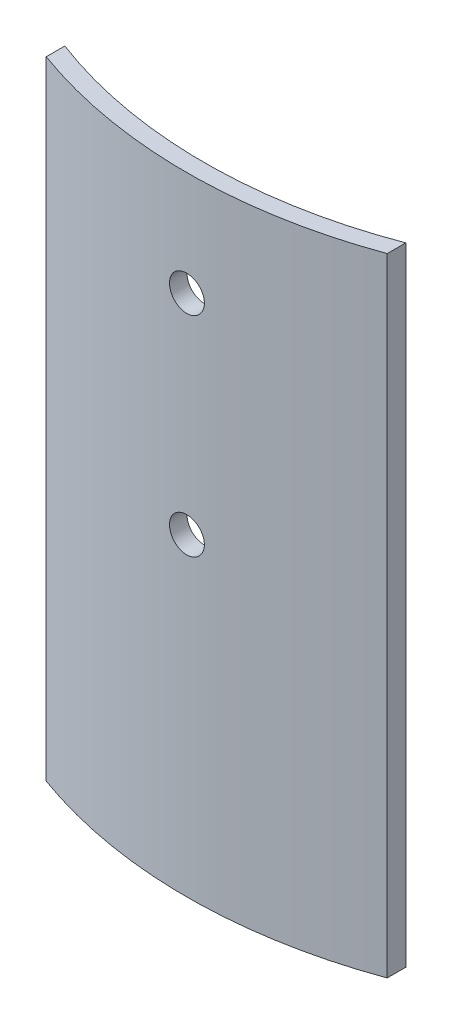
ISO-10303-21;
HEADER;
FILE_DESCRIPTION(('STEP AP214'),'2;1');
FILE_NAME('part.step','',(''),(''),'','','');
FILE_SCHEMA(('AUTOMOTIVE_DESIGN { 1 0 10303 214 1 1 1 1 }'));
ENDSEC;
DATA;
#1=APPLICATION_CONTEXT('core data for automotive mechanical design processes');
#2=APPLICATION_PROTOCOL_DEFINITION('international standard','automotive_design',2000,#1);
#3=PRODUCT_CONTEXT('',#1,'mechanical');
#4=PRODUCT('Part','Part','',(#3));
#5=PRODUCT_RELATED_PRODUCT_CATEGORY('part','',(#4));
#6=PRODUCT_DEFINITION_FORMATION('','',#4);
#7=PRODUCT_DEFINITION_CONTEXT('part definition',#1,'design');
#8=PRODUCT_DEFINITION('design','',#6,#7);
#9=PRODUCT_DEFINITION_SHAPE('','',#8);
#10=(LENGTH_UNIT() NAMED_UNIT(*) SI_UNIT(.MILLI.,.METRE.));
#11=(NAMED_UNIT(*) PLANE_ANGLE_UNIT() SI_UNIT($,.RADIAN.));
#12=(NAMED_UNIT(*) SI_UNIT($,.STERADIAN.) SOLID_ANGLE_UNIT());
#13=UNCERTAINTY_MEASURE_WITH_UNIT(LENGTH_MEASURE(1.E-05),#10,'distance_accuracy_value','');
#14=(GEOMETRIC_REPRESENTATION_CONTEXT(3) GLOBAL_UNCERTAINTY_ASSIGNED_CONTEXT((#13)) GLOBAL_UNIT_ASSIGNED_CONTEXT((#10,
#11,#12)) REPRESENTATION_CONTEXT('',''));
#15=CARTESIAN_POINT('',(0.,0.,0.));
#16=DIRECTION('',(0.,0.,1.));
#17=DIRECTION('',(1.,0.,0.));
#18=AXIS2_PLACEMENT_3D('',#15,#16,#17);
#19=CARTESIAN_POINT('',(-24.4566001041803,90.,0.));
#20=DIRECTION('',(1.,0.,0.));
#21=DIRECTION('',(0.,0.,-1.));
#22=AXIS2_PLACEMENT_3D('',#19,#20,#21);
#23=PLANE('',#22);
#24=DIRECTION('',(0.,0.,1.));
#25=VECTOR('',#24,1.);
#26=CARTESIAN_POINT('',(-24.4566001041803,0.,0.));
#27=LINE('',#26,#25);
#28=CARTESIAN_POINT('',(-24.4566001041803,0.,64.5203433914003));
#29=VERTEX_POINT('',#28);
#30=CARTESIAN_POINT('',(-24.4566001041803,0.,67.1872362234391));
#31=VERTEX_POINT('',#30);
#32=EDGE_CURVE('E111',#29,#31,#27,.T.);
#33=ORIENTED_EDGE('',*,*,#32,.T.);
#34=DIRECTION('',(0.,-1.,0.));
#35=VECTOR('',#34,1.);
#36=CARTESIAN_POINT('',(-24.4566001041803,90.,67.1872362234391));
#37=LINE('',#36,#35);
#38=CARTESIAN_POINT('',(-24.4566001041803,90.,67.1872362234391));
#39=VERTEX_POINT('',#38);
#40=EDGE_CURVE('E11',#39,#31,#37,.T.);
#41=ORIENTED_EDGE('',*,*,#40,.F.);
#42=DIRECTION('',(0.,0.,1.));
#43=VECTOR('',#42,1.);
#44=CARTESIAN_POINT('',(-24.4566001041803,90.,0.));
#45=LINE('',#44,#43);
#46=CARTESIAN_POINT('',(-24.4566001041803,90.,64.5203433914003));
#47=VERTEX_POINT('',#46);
#48=EDGE_CURVE('E96',#47,#39,#45,.T.);
#49=ORIENTED_EDGE('',*,*,#48,.F.);
#50=DIRECTION('',(0.,-1.,0.));
#51=VECTOR('',#50,1.);
#52=CARTESIAN_POINT('',(-24.4566001041803,90.,64.5203433914003));
#53=LINE('',#52,#51);
#54=EDGE_CURVE('E63',#47,#29,#53,.T.);
#55=ORIENTED_EDGE('',*,*,#54,.T.);
#56=EDGE_LOOP('',(#33,#41,#49,#55));
#57=FACE_BOUND('',#56,.T.);
#58=ADVANCED_FACE('F40',(#57),#23,.F.);
#59=CARTESIAN_POINT('',(0.,90.,0.));
#60=DIRECTION('',(0.,-1.,0.));
#61=DIRECTION('',(0.,0.,-1.));
#62=AXIS2_PLACEMENT_3D('',#59,#60,#61);
#63=CYLINDRICAL_SURFACE('',#62,71.5);
#64=CARTESIAN_POINT('',(2.5,75.,71.4562803397994));
#65=CARTESIAN_POINT('',(2.49999378886062,74.8596199603397,71.4562809291882));
#66=CARTESIAN_POINT('',(2.48813637334938,74.7191392243361,71.4566984612171));
#67=CARTESIAN_POINT('',(2.44100110362231,74.4420498246256,71.4583238557862));
#68=CARTESIAN_POINT('',(2.40569535024231,74.3054459758258,71.4595326597683));
#69=CARTESIAN_POINT('',(2.31267254222734,74.0401645764343,71.4626034999009));
#70=CARTESIAN_POINT('',(2.25496654430358,73.9114831516016,71.4644652137328));
#71=CARTESIAN_POINT('',(2.11879739659357,73.6656695587712,71.4686316847911));
#72=CARTESIAN_POINT('',(2.04033928007349,73.5485345997109,71.4709363345498));
#73=CARTESIAN_POINT('',(1.86484168475676,73.3290365963715,71.4757305087568));
#74=CARTESIAN_POINT('',(1.76779318294987,73.226680767758,71.4782201226185));
#75=CARTESIAN_POINT('',(1.55788623746994,73.039707523366,71.4831028161751));
#76=CARTESIAN_POINT('',(1.44502716135308,72.9550908175141,71.4854958920035));
#77=CARTESIAN_POINT('',(1.20667201587696,72.8059834371474,71.4899162999675));
#78=CARTESIAN_POINT('',(1.08117295016827,72.741497549629,71.4919435450623));
#79=CARTESIAN_POINT('',(0.821121544701844,72.6345133008608,71.495403012802));
#80=CARTESIAN_POINT('',(0.686569247728687,72.5920148357091,71.4968352382589));
#81=CARTESIAN_POINT('',(0.412289571420974,72.5302285796561,71.4989427039839));
#82=CARTESIAN_POINT('',(0.272564348860591,72.5109312252755,71.4996182561445));
#83=CARTESIAN_POINT('',(-0.00814381158609388,72.4960654921831,71.5001372743444));
#84=CARTESIAN_POINT('',(-0.149126743467153,72.5004970002324,71.4999807443547));
#85=CARTESIAN_POINT('',(-0.428283563094081,72.5329551703847,71.4988535073153));
#86=CARTESIAN_POINT('',(-0.566458651616255,72.5609715192641,71.4978831561356));
#87=CARTESIAN_POINT('',(-0.836143222162108,72.6397881258803,71.4952380350116));
#88=CARTESIAN_POINT('',(-0.967652686835606,72.6905884429189,71.4935632632337));
#89=CARTESIAN_POINT('',(-1.22030614234006,72.8135427686462,71.4896974219631));
#90=CARTESIAN_POINT('',(-1.34144783394711,72.8857014981762,71.4875062383498));
#91=CARTESIAN_POINT('',(-1.56990178125832,73.0493208366891,71.4828544782273));
#92=CARTESIAN_POINT('',(-1.67721399202991,73.1407815083822,71.4803939008428));
#93=CARTESIAN_POINT('',(-1.87502290090171,73.3404668575786,71.4754790568111));
#94=CARTESIAN_POINT('',(-1.96551056684102,73.4487004827125,71.4730247942469));
#95=CARTESIAN_POINT('',(-2.12703222654569,73.678827849142,71.4684005991786));
#96=CARTESIAN_POINT('',(-2.19806621679346,73.8007215929075,71.4662306667257));
#97=CARTESIAN_POINT('',(-2.31866318548506,74.0547142307168,71.4624199093821));
#98=CARTESIAN_POINT('',(-2.36822586163521,74.1868132684096,71.4607790919407));
#99=CARTESIAN_POINT('',(-2.44446743933415,74.4574643445193,71.458211889731));
#100=CARTESIAN_POINT('',(-2.47114642533175,74.5960163591205,71.4572855023263));
#101=CARTESIAN_POINT('',(-2.50085220282281,74.8755617950786,71.4562520986877));
#102=CARTESIAN_POINT('',(-2.50389151225942,75.016553884691,71.4561446488015));
#103=CARTESIAN_POINT('',(-2.4862642921378,75.2970462553616,71.4567601046832));
#104=CARTESIAN_POINT('',(-2.46559780029724,75.4365465387931,71.4574830091299));
#105=CARTESIAN_POINT('',(-2.40115599510036,75.7100604104811,71.4596772883669));
#106=CARTESIAN_POINT('',(-2.35738637875247,75.8440753425976,71.4611484786339));
#107=CARTESIAN_POINT('',(-2.24798655903736,76.1028556022163,71.4646733315948));
#108=CARTESIAN_POINT('',(-2.18235629497473,76.2276209040361,71.4667269959059));
#109=CARTESIAN_POINT('',(-2.03106594871204,76.4644179143893,71.4711863545384));
#110=CARTESIAN_POINT('',(-1.9453974398828,76.5764442362976,71.4735921968006));
#111=CARTESIAN_POINT('',(-1.75647478018708,76.7845291444771,71.478484185749));
#112=CARTESIAN_POINT('',(-1.65322057085681,76.8805876776612,71.4809703327021));
#113=CARTESIAN_POINT('',(-1.43200387649542,77.0540520914972,71.4857439405565));
#114=CARTESIAN_POINT('',(-1.31403505776439,77.1314498975649,71.4880313151752));
#115=CARTESIAN_POINT('',(-1.0667700902014,77.2653406190984,71.4921483142205));
#116=CARTESIAN_POINT('',(-0.937473971713528,77.3218335905629,71.4939779398734));
#117=CARTESIAN_POINT('',(-0.671255009445087,77.4122968540137,71.496972791538));
#118=CARTESIAN_POINT('',(-0.534333940446578,77.4462723636044,71.4981381714557));
#119=CARTESIAN_POINT('',(-0.256726696015539,77.4907533674852,71.4996737805818));
#120=CARTESIAN_POINT('',(-0.116040527495593,77.5012589048624,71.50004401125));
#121=CARTESIAN_POINT('',(0.165022809490814,77.4985011635399,71.4999475997321));
#122=CARTESIAN_POINT('',(0.305400102949971,77.4852505899914,71.4994814048797));
#123=CARTESIAN_POINT('',(0.581936231605576,77.4353829291175,71.4977655414523));
#124=CARTESIAN_POINT('',(0.718095058515618,77.3987657958958,71.4965158713385));
#125=CARTESIAN_POINT('',(0.982333259282704,77.3032065068768,71.4933737836176));
#126=CARTESIAN_POINT('',(1.11041250849163,77.2442640067519,71.4914813560973));
#127=CARTESIAN_POINT('',(1.35485554697132,77.1057306386187,71.4872669019007));
#128=CARTESIAN_POINT('',(1.47121974676568,77.0261404945034,71.4849448902862));
#129=CARTESIAN_POINT('',(1.68899000419353,76.8485303733804,71.4801315247319));
#130=CARTESIAN_POINT('',(1.79038963975965,76.7505025246098,71.4776400987537));
#131=CARTESIAN_POINT('',(1.9753212141982,76.5387864204383,71.472768861064));
#132=CARTESIAN_POINT('',(2.05884872835068,76.4250942983556,71.4703890771059));
#133=CARTESIAN_POINT('',(2.2056842037936,76.1852234779136,71.466008523013));
#134=CARTESIAN_POINT('',(2.26897775727134,76.0590359654438,71.4640080233623));
#135=CARTESIAN_POINT('',(2.3734065260776,75.7979153653011,71.4606164059693));
#136=CARTESIAN_POINT('',(2.41456811426175,75.6629929022226,71.4592245633112));
#137=CARTESIAN_POINT('',(2.46267872926961,75.4393507775201,71.4575785563825));
#138=CARTESIAN_POINT('',(2.47665654387209,75.3520821464789,71.4570938466384));
#139=CARTESIAN_POINT('',(2.4953191307325,75.1765556228304,71.4564445530515));
#140=CARTESIAN_POINT('',(2.50000390674852,75.0882977306232,71.4562799690793));
#141=CARTESIAN_POINT('',(2.5,75.,71.4562803397994));
#142=B_SPLINE_CURVE_WITH_KNOTS('',3,(#64,#65,#66,#67,#68,#69,#70,#71,#72,#73,#74,#75,#76,#77,
#78,#79,#80,#81,#82,#83,#84,#85,#86,#87,#88,#89,#90,#91,#92,#93,#94,#95,#96,#97,#98,#99,#100,
#101,#102,#103,#104,#105,#106,#107,#108,#109,#110,#111,#112,#113,#114,#115,#116,#117,#118,#119,
#120,#121,#122,#123,#124,#125,#126,#127,#128,#129,#130,#131,#132,#133,#134,#135,#136,#137,#138,
#139,#140,#141),.UNSPECIFIED.,.T.,.F.,(4,2,2,2,2,2,2,2,2,2,2,2,2,2,2,2,2,2,2,2,2,2,2,2,2,2,2,2,
2,2,2,2,2,2,2,2,2,2,4),(0.,0.420817816246982,0.842137226625239,1.26324893857242,
1.68425860663462,2.10547313564977,2.52670451861502,2.94803599188645,3.36936547413172,
3.79052122509494,4.21167496622136,4.63264464005147,5.05361540958169,5.47467929568186,
5.89574454980207,6.31703520182081,6.73832593001647,7.15962258935259,7.58091769395036,
8.00198969450399,8.42306102510209,8.84402857203189,9.26499728777504,9.68614335164778,
10.107290815651,10.5286201863924,10.9499484284921,11.3711790089036,11.7924088160044,
12.2134134098084,12.6344188305466,13.0554307447806,13.4764279006026,13.8976052059233,
14.3188866645651,14.7404674365335,15.1615447254803,15.4262352989882,15.6909257654556),.UNSPECIFIED.);
#143=CARTESIAN_POINT('',(2.5,75.,71.4562803397994));
#144=VERTEX_POINT('',#143);
#145=EDGE_CURVE('E113',#144,#144,#142,.T.);
#146=ORIENTED_EDGE('',*,*,#145,.T.);
#147=EDGE_LOOP('',(#146));
#148=FACE_BOUND('',#147,.T.);
#149=CARTESIAN_POINT('',(2.5,45.,71.4562803397994));
#150=CARTESIAN_POINT('',(2.49999378886062,44.8596199603396,71.4562809291882));
#151=CARTESIAN_POINT('',(2.48813637334938,44.7191392243361,71.4566984612171));
#152=CARTESIAN_POINT('',(2.44100110362231,44.4420498246256,71.4583238557862));
#153=CARTESIAN_POINT('',(2.40569535024231,44.3054459758258,71.4595326597683));
#154=CARTESIAN_POINT('',(2.31267254222734,44.0401645764343,71.4626034999009));
#155=CARTESIAN_POINT('',(2.25496654430359,43.9114831516016,71.4644652137328));
#156=CARTESIAN_POINT('',(2.11879739659358,43.6656695587712,71.4686316847911));
#157=CARTESIAN_POINT('',(2.04033928007349,43.5485345997109,71.4709363345498));
#158=CARTESIAN_POINT('',(1.86484168475676,43.3290365963715,71.4757305087568));
#159=CARTESIAN_POINT('',(1.76779318294987,43.226680767758,71.4782201226185));
#160=CARTESIAN_POINT('',(1.55788623746994,43.039707523366,71.4831028161751));
#161=CARTESIAN_POINT('',(1.44502716135308,42.9550908175141,71.4854958920035));
#162=CARTESIAN_POINT('',(1.20667201587696,42.8059834371474,71.4899162999675));
#163=CARTESIAN_POINT('',(1.08117295016826,42.741497549629,71.4919435450623));
#164=CARTESIAN_POINT('',(0.821121544701841,42.6345133008608,71.495403012802));
#165=CARTESIAN_POINT('',(0.686569247728684,42.5920148357091,71.4968352382589));
#166=CARTESIAN_POINT('',(0.412289571420973,42.5302285796561,71.4989427039839));
#167=CARTESIAN_POINT('',(0.27256434886059,42.5109312252755,71.4996182561445));
#168=CARTESIAN_POINT('',(-0.0081438115860948,42.4960654921831,71.5001372743444));
#169=CARTESIAN_POINT('',(-0.149126743467154,42.5004970002324,71.4999807443547));
#170=CARTESIAN_POINT('',(-0.42828356309408,42.5329551703847,71.4988535073153));
#171=CARTESIAN_POINT('',(-0.566458651616253,42.5609715192641,71.4978831561356));
#172=CARTESIAN_POINT('',(-0.836143222162106,42.6397881258803,71.4952380350116));
#173=CARTESIAN_POINT('',(-0.967652686835607,42.6905884429189,71.4935632632337));
#174=CARTESIAN_POINT('',(-1.22030614234006,42.8135427686462,71.4896974219631));
#175=CARTESIAN_POINT('',(-1.34144783394711,42.8857014981762,71.4875062383498));
#176=CARTESIAN_POINT('',(-1.56990178125832,43.0493208366891,71.4828544782273));
#177=CARTESIAN_POINT('',(-1.67721399202991,43.1407815083822,71.4803939008429));
#178=CARTESIAN_POINT('',(-1.87502290090171,43.3404668575786,71.4754790568111));
#179=CARTESIAN_POINT('',(-1.96551056684102,43.4487004827125,71.4730247942469));
#180=CARTESIAN_POINT('',(-2.12703222654569,43.678827849142,71.4684005991786));
#181=CARTESIAN_POINT('',(-2.19806621679347,43.8007215929075,71.4662306667257));
#182=CARTESIAN_POINT('',(-2.31866318548506,44.0547142307168,71.4624199093821));
#183=CARTESIAN_POINT('',(-2.36822586163521,44.1868132684096,71.4607790919407));
#184=CARTESIAN_POINT('',(-2.44446743933415,44.4574643445193,71.458211889731));
#185=CARTESIAN_POINT('',(-2.47114642533175,44.5960163591205,71.4572855023263));
#186=CARTESIAN_POINT('',(-2.50085220282281,44.8755617950786,71.4562520986877));
#187=CARTESIAN_POINT('',(-2.50389151225942,45.016553884691,71.4561446488015));
#188=CARTESIAN_POINT('',(-2.48626429213779,45.2970462553616,71.4567601046832));
#189=CARTESIAN_POINT('',(-2.46559780029724,45.4365465387931,71.4574830091299));
#190=CARTESIAN_POINT('',(-2.40115599510036,45.7100604104811,71.4596772883669));
#191=CARTESIAN_POINT('',(-2.35738637875246,45.8440753425976,71.4611484786339));
#192=CARTESIAN_POINT('',(-2.24798655903736,46.1028556022163,71.4646733315948));
#193=CARTESIAN_POINT('',(-2.18235629497473,46.2276209040361,71.4667269959059));
#194=CARTESIAN_POINT('',(-2.03106594871204,46.4644179143893,71.4711863545384));
#195=CARTESIAN_POINT('',(-1.9453974398828,46.5764442362976,71.4735921968006));
#196=CARTESIAN_POINT('',(-1.75647478018708,46.7845291444771,71.478484185749));
#197=CARTESIAN_POINT('',(-1.65322057085681,46.8805876776612,71.4809703327021));
#198=CARTESIAN_POINT('',(-1.43200387649542,47.0540520914972,71.4857439405565));
#199=CARTESIAN_POINT('',(-1.31403505776439,47.1314498975649,71.4880313151752));
#200=CARTESIAN_POINT('',(-1.0667700902014,47.2653406190984,71.4921483142205));
#201=CARTESIAN_POINT('',(-0.93747397171353,47.3218335905629,71.4939779398734));
#202=CARTESIAN_POINT('',(-0.671255009445091,47.4122968540137,71.496972791538));
#203=CARTESIAN_POINT('',(-0.534333940446581,47.4462723636044,71.4981381714557));
#204=CARTESIAN_POINT('',(-0.256726696015539,47.4907533674852,71.4996737805818));
#205=CARTESIAN_POINT('',(-0.116040527495591,47.5012589048624,71.50004401125));
#206=CARTESIAN_POINT('',(0.165022809490816,47.4985011635399,71.4999475997321));
#207=CARTESIAN_POINT('',(0.30540010294997,47.4852505899914,71.4994814048797));
#208=CARTESIAN_POINT('',(0.581936231605575,47.4353829291175,71.4977655414523));
#209=CARTESIAN_POINT('',(0.718095058515618,47.3987657958958,71.4965158713385));
#210=CARTESIAN_POINT('',(0.982333259282705,47.3032065068768,71.4933737836176));
#211=CARTESIAN_POINT('',(1.11041250849163,47.2442640067519,71.4914813560973));
#212=CARTESIAN_POINT('',(1.35485554697132,47.1057306386187,71.4872669019007));
#213=CARTESIAN_POINT('',(1.47121974676567,47.0261404945034,71.4849448902862));
#214=CARTESIAN_POINT('',(1.68899000419352,46.8485303733804,71.4801315247319));
#215=CARTESIAN_POINT('',(1.79038963975965,46.7505025246099,71.4776400987537));
#216=CARTESIAN_POINT('',(1.97532121419819,46.5387864204383,71.472768861064));
#217=CARTESIAN_POINT('',(2.05884872835068,46.4250942983556,71.4703890771059));
#218=CARTESIAN_POINT('',(2.20568420379359,46.1852234779136,71.466008523013));
#219=CARTESIAN_POINT('',(2.26897775727134,46.0590359654438,71.4640080233623));
#220=CARTESIAN_POINT('',(2.3734065260776,45.7979153653011,71.4606164059693));
#221=CARTESIAN_POINT('',(2.41456811426175,45.6629929022226,71.4592245633112));
#222=CARTESIAN_POINT('',(2.46267872926961,45.4393507775201,71.4575785563825));
#223=CARTESIAN_POINT('',(2.47665654387209,45.3520821464789,71.4570938466384));
#224=CARTESIAN_POINT('',(2.4953191307325,45.1765556228304,71.4564445530515));
#225=CARTESIAN_POINT('',(2.50000390674852,45.0882977306232,71.4562799690793));
#226=CARTESIAN_POINT('',(2.5,45.,71.4562803397994));
#227=B_SPLINE_CURVE_WITH_KNOTS('',3,(#149,#150,#151,#152,#153,#154,#155,#156,#157,#158,#159,
#160,#161,#162,#163,#164,#165,#166,#167,#168,#169,#170,#171,#172,#173,#174,#175,#176,#177,#178,
#179,#180,#181,#182,#183,#184,#185,#186,#187,#188,#189,#190,#191,#192,#193,#194,#195,#196,#197,
#198,#199,#200,#201,#202,#203,#204,#205,#206,#207,#208,#209,#210,#211,#212,#213,#214,#215,#216,
#217,#218,#219,#220,#221,#222,#223,#224,#225,#226),.UNSPECIFIED.,.T.,.F.,(4,2,2,2,2,2,2,2,2,2,2,
2,2,2,2,2,2,2,2,2,2,2,2,2,2,2,2,2,2,2,2,2,2,2,2,2,2,2,4),(0.,0.420817816246996,
0.842137226625239,1.26324893857239,1.68425860663461,2.10547313564978,2.52670451861503,
2.94803599188646,3.36936547413172,3.79052122509494,4.21167496622136,4.63264464005147,
5.05361540958169,5.47467929568185,5.89574454980208,6.31703520182081,6.73832593001647,
7.15962258935258,7.58091769395038,8.00198969450402,8.42306102510211,8.84402857203191,
9.26499728777506,9.68614335164779,10.107290815651,10.5286201863924,10.9499484284921,
11.3711790089036,11.7924088160044,12.2134134098084,12.6344188305466,13.0554307447806,
13.4764279006026,13.8976052059233,14.3188866645651,14.7404674365335,15.1615447254803,
15.4262352989882,15.6909257654556),.UNSPECIFIED.);
#228=CARTESIAN_POINT('',(2.5,45.,71.4562803397994));
#229=VERTEX_POINT('',#228);
#230=EDGE_CURVE('E127',#229,#229,#227,.T.);
#231=ORIENTED_EDGE('',*,*,#230,.T.);
#232=EDGE_LOOP('',(#231));
#233=FACE_BOUND('',#232,.T.);
#234=CARTESIAN_POINT('',(0.,0.,0.));
#235=DIRECTION('',(0.,1.,0.));
#236=DIRECTION('',(0.,0.,1.));
#237=AXIS2_PLACEMENT_3D('',#234,#235,#236);
#238=CIRCLE('',#237,71.5);
#239=CARTESIAN_POINT('',(24.4566001041803,0.,67.1872362234391));
#240=VERTEX_POINT('',#239);
#241=EDGE_CURVE('E101',#31,#240,#238,.T.);
#242=ORIENTED_EDGE('',*,*,#241,.T.);
#243=DIRECTION('',(0.,-1.,0.));
#244=VECTOR('',#243,1.);
#245=CARTESIAN_POINT('',(24.4566001041803,90.,67.1872362234391));
#246=LINE('',#245,#244);
#247=CARTESIAN_POINT('',(24.4566001041803,90.,67.1872362234391));
#248=VERTEX_POINT('',#247);
#249=EDGE_CURVE('E54',#248,#240,#246,.T.);
#250=ORIENTED_EDGE('',*,*,#249,.F.);
#251=CARTESIAN_POINT('',(0.,90.,0.));
#252=DIRECTION('',(0.,1.,0.));
#253=DIRECTION('',(0.,0.,1.));
#254=AXIS2_PLACEMENT_3D('',#251,#252,#253);
#255=CIRCLE('',#254,71.5);
#256=EDGE_CURVE('E88',#39,#248,#255,.T.);
#257=ORIENTED_EDGE('',*,*,#256,.F.);
#258=ORIENTED_EDGE('',*,*,#40,.T.);
#259=EDGE_LOOP('',(#242,#250,#257,#258));
#260=FACE_BOUND('',#259,.T.);
#261=ADVANCED_FACE('F100',(#148,#233,#260),#63,.T.);
#262=CARTESIAN_POINT('',(24.4566001041803,90.,0.));
#263=DIRECTION('',(1.,0.,0.));
#264=DIRECTION('',(0.,0.,-1.));
#265=AXIS2_PLACEMENT_3D('',#262,#263,#264);
#266=PLANE('',#265);
#267=DIRECTION('',(0.,0.,1.));
#268=VECTOR('',#267,1.);
#269=CARTESIAN_POINT('',(24.4566001041803,0.,0.));
#270=LINE('',#269,#268);
#271=CARTESIAN_POINT('',(24.4566001041803,0.,64.5203433914003));
#272=VERTEX_POINT('',#271);
#273=EDGE_CURVE('E115',#272,#240,#270,.T.);
#274=ORIENTED_EDGE('',*,*,#273,.F.);
#275=DIRECTION('',(0.,-1.,0.));
#276=VECTOR('',#275,1.);
#277=CARTESIAN_POINT('',(24.4566001041803,90.,64.5203433914003));
#278=LINE('',#277,#276);
#279=CARTESIAN_POINT('',(24.4566001041803,90.,64.5203433914003));
#280=VERTEX_POINT('',#279);
#281=EDGE_CURVE('E77',#280,#272,#278,.T.);
#282=ORIENTED_EDGE('',*,*,#281,.F.);
#283=DIRECTION('',(0.,0.,1.));
#284=VECTOR('',#283,1.);
#285=CARTESIAN_POINT('',(24.4566001041803,90.,0.));
#286=LINE('',#285,#284);
#287=EDGE_CURVE('E95',#280,#248,#286,.T.);
#288=ORIENTED_EDGE('',*,*,#287,.T.);
#289=ORIENTED_EDGE('',*,*,#249,.T.);
#290=EDGE_LOOP('',(#274,#282,#288,#289));
#291=FACE_BOUND('',#290,.T.);
#292=ADVANCED_FACE('F105',(#291),#266,.T.);
#293=CARTESIAN_POINT('',(0.,90.,0.));
#294=DIRECTION('',(0.,-1.,0.));
#295=DIRECTION('',(0.,0.,-1.));
#296=AXIS2_PLACEMENT_3D('',#293,#294,#295);
#297=CYLINDRICAL_SURFACE('',#296,69.);
#298=CARTESIAN_POINT('',(2.5,75.,68.9546952716057));
#299=CARTESIAN_POINT('',(2.49999379007855,74.8596233589306,68.954695882213));
#300=CARTESIAN_POINT('',(2.48813694639965,74.7191461045909,68.9551285410902));
#301=CARTESIAN_POINT('',(2.44100408053935,74.44206380551,68.9568128159695));
#302=CARTESIAN_POINT('',(2.40570018215893,74.3054635719743,68.958065406763));
#303=CARTESIAN_POINT('',(2.31268259120878,74.0401894216517,68.9612474686125));
#304=CARTESIAN_POINT('',(2.25497998058534,73.9115116215955,68.9631766048964));
#305=CARTESIAN_POINT('',(2.11881911958898,73.6657045599725,68.9674939562401));
#306=CARTESIAN_POINT('',(2.0403658926712,73.5485725127365,68.9698820601516));
#307=CARTESIAN_POINT('',(1.86487683333942,73.3290759287356,68.9748499133067));
#308=CARTESIAN_POINT('',(1.76783145576545,73.2267190250265,68.9774297605726));
#309=CARTESIAN_POINT('',(1.55793057281834,73.0397428501795,68.9824894440523));
#310=CARTESIAN_POINT('',(1.44507443411207,72.955124289927,68.9849692762545));
#311=CARTESIAN_POINT('',(1.20672223052752,72.8060109504239,68.9895500178501));
#312=CARTESIAN_POINT('',(1.08122293037311,72.7415213393882,68.9916508298697));
#313=CARTESIAN_POINT('',(0.821169803291142,72.6345299274506,68.9952358727837));
#314=CARTESIAN_POINT('',(0.686616020969726,72.5920280182372,68.9967201067155));
#315=CARTESIAN_POINT('',(0.412336523050773,72.530236512318,68.9989041112963));
#316=CARTESIAN_POINT('',(0.272613124354335,72.5109366438394,68.999604229072));
#317=CARTESIAN_POINT('',(-0.00809194127061118,72.4960654046588,69.0001422509263));
#318=CARTESIAN_POINT('',(-0.149073601915507,72.5004939155262,68.9999801593084));
#319=CARTESIAN_POINT('',(-0.428223675245711,72.5329451155522,68.9988123276285));
#320=CARTESIAN_POINT('',(-0.566393377195182,72.5609567304853,68.9978069835443));
#321=CARTESIAN_POINT('',(-0.836067970328101,72.639761847395,68.9950663910294));
#322=CARTESIAN_POINT('',(-0.967572843409253,72.6905554112458,68.9933311406162));
#323=CARTESIAN_POINT('',(-1.22022050142356,72.813495269484,68.9893255967076));
#324=CARTESIAN_POINT('',(-1.34136081832652,72.8856466314953,68.987055176257));
#325=CARTESIAN_POINT('',(-1.56981360031443,73.0492502327587,68.9822351151495));
#326=CARTESIAN_POINT('',(-1.67712601674663,73.1407025399172,68.9796854735102));
#327=CARTESIAN_POINT('',(-1.87494135202961,73.3403746967811,68.9745925226373));
#328=CARTESIAN_POINT('',(-1.96543457356238,73.4486041540217,68.9720492178858));
#329=CARTESIAN_POINT('',(-2.1269680795502,73.6787245238816,68.967257147431));
#330=CARTESIAN_POINT('',(-2.19800836039247,73.8006154390381,68.9650083817824));
#331=CARTESIAN_POINT('',(-2.31861841142306,74.0546042449107,68.9610590696051));
#332=CARTESIAN_POINT('',(-2.36818785419453,74.1867022912431,68.9593585314365));
#333=CARTESIAN_POINT('',(-2.44444283068381,74.4573530598243,68.9566977706466));
#334=CARTESIAN_POINT('',(-2.47112845502363,74.5959057565099,68.9557375450934));
#335=CARTESIAN_POINT('',(-2.500846363931,74.8754484206452,68.9546662190682));
#336=CARTESIAN_POINT('',(-2.50389208979828,75.0164369573978,68.9545546360711));
#337=CARTESIAN_POINT('',(-2.48627878490516,75.2969232845949,68.9551919182319));
#338=CARTESIAN_POINT('',(-2.4656197947276,75.4364210775912,68.9559407819168));
#339=CARTESIAN_POINT('',(-2.40119462771575,75.709928510804,68.958214102139));
#340=CARTESIAN_POINT('',(-2.35743457062276,75.8439395943871,68.9597383532633));
#341=CARTESIAN_POINT('',(-2.24805565936224,76.1027138779889,68.9633904532094));
#342=CARTESIAN_POINT('',(-2.18243673983806,76.2274770503556,68.9655183038359));
#343=CARTESIAN_POINT('',(-2.03116817905213,76.4642758342056,68.9701389192657));
#344=CARTESIAN_POINT('',(-1.94550949086126,76.5763056631955,68.9726318486927));
#345=CARTESIAN_POINT('',(-1.75660619542697,76.7843995374044,68.977701023183));
#346=CARTESIAN_POINT('',(-1.65336152591893,76.8804635260927,68.9802772685413));
#347=CARTESIAN_POINT('',(-1.43215939502433,77.0539437546236,68.9852240737414));
#348=CARTESIAN_POINT('',(-1.31419513100662,77.1313513236335,68.9875945376172));
#349=CARTESIAN_POINT('',(-1.06693698955008,77.2652621258812,68.9918612151552));
#350=CARTESIAN_POINT('',(-0.937643143808872,77.3217654176022,68.9937574301441));
#351=CARTESIAN_POINT('',(-0.671428596182869,77.4122485385255,68.9968614109348));
#352=CARTESIAN_POINT('',(-0.534509799330774,77.44623396651,68.9980693478576));
#353=CARTESIAN_POINT('',(-0.256905086228002,77.4907349901391,68.9996612946415));
#354=CARTESIAN_POINT('',(-0.116219177905504,77.5012506351739,69.0000453062363));
#355=CARTESIAN_POINT('',(0.164839761175281,77.4985129637643,68.9999461287075));
#356=CARTESIAN_POINT('',(0.305212925167433,77.4852732864192,68.9994634372005));
#357=CARTESIAN_POINT('',(0.581742556650373,77.4354288965293,68.9976862071822));
#358=CARTESIAN_POINT('',(0.717899015877736,77.3988241381993,68.99639166708));
#359=CARTESIAN_POINT('',(0.982134431232901,77.3032909474527,68.9931365090797));
#360=CARTESIAN_POINT('',(1.11021326607166,77.2443621799244,68.9911758811828));
#361=CARTESIAN_POINT('',(1.35465801258925,77.1058573064545,68.9868093541033));
#362=CARTESIAN_POINT('',(1.47102433108578,77.0262819179878,68.9844034703943));
#363=CARTESIAN_POINT('',(1.68880618406308,76.848698226579,68.9794159575258));
#364=CARTESIAN_POINT('',(1.7902147092718,76.7506813305312,68.9768342467964));
#365=CARTESIAN_POINT('',(1.97516602329404,76.5389855125482,68.9717862898133));
#366=CARTESIAN_POINT('',(2.05870438949353,76.4253027249434,68.9693200722602));
#367=CARTESIAN_POINT('',(2.20556462004963,76.1854461786243,68.9647801707312));
#368=CARTESIAN_POINT('',(2.26887172475299,76.0592633880868,68.9627067737833));
#369=CARTESIAN_POINT('',(2.37332803581842,75.7981491837266,68.959191347881));
#370=CARTESIAN_POINT('',(2.41450360041329,75.6632283923425,68.9577485682583));
#371=CARTESIAN_POINT('',(2.46264478301194,75.4395490704095,68.9560418019575));
#372=CARTESIAN_POINT('',(2.47663529689087,75.3522416456128,68.9555390553658));
#373=CARTESIAN_POINT('',(2.49531485728884,75.1766360948456,68.9548655981369));
#374=CARTESIAN_POINT('',(2.50000390785709,75.0883379693065,68.954694887355));
#375=CARTESIAN_POINT('',(2.5,75.,68.9546952716057));
#376=B_SPLINE_CURVE_WITH_KNOTS('',3,(#298,#299,#300,#301,#302,#303,#304,#305,#306,#307,#308,
#309,#310,#311,#312,#313,#314,#315,#316,#317,#318,#319,#320,#321,#322,#323,#324,#325,#326,#327,
#328,#329,#330,#331,#332,#333,#334,#335,#336,#337,#338,#339,#340,#341,#342,#343,#344,#345,#346,
#347,#348,#349,#350,#351,#352,#353,#354,#355,#356,#357,#358,#359,#360,#361,#362,#363,#364,#365,
#366,#367,#368,#369,#370,#371,#372,#373,#374,#375),.UNSPECIFIED.,.T.,.F.,(4,2,2,2,2,2,2,2,2,2,2,
2,2,2,2,2,2,2,2,2,2,2,2,2,2,2,2,2,2,2,2,2,2,2,2,2,2,2,4),(0.,0.420807472356826,
0.842116140375681,1.26321662761671,1.68421526504769,2.10543062407293,2.52666286058762,
2.94800316192271,3.36934138771168,3.79049301413,4.21164253854225,4.63259440852083,
5.05354742178252,5.47460039590144,5.89565485143279,6.31695132317939,6.73824787316844,
7.15955084744005,7.58085215330549,8.00191389586353,8.42297491755845,8.84392445122516,
9.26487524351614,9.68601644149722,10.1071591305943,10.5284971758445,10.9498340423232,
11.3710661093653,11.7922972899613,12.2132866984015,12.6342769317972,13.0552734850404,
13.4762554105137,13.8974339870367,14.3187166790719,14.74030601863,15.1613921346359,
15.4262032419289,15.6910142339418),.UNSPECIFIED.);
#377=CARTESIAN_POINT('',(2.5,75.,68.9546952716057));
#378=VERTEX_POINT('',#377);
#379=EDGE_CURVE('E43',#378,#378,#376,.T.);
#380=ORIENTED_EDGE('',*,*,#379,.F.);
#381=EDGE_LOOP('',(#380));
#382=FACE_BOUND('',#381,.T.);
#383=CARTESIAN_POINT('',(2.5,45.,68.9546952716057));
#384=CARTESIAN_POINT('',(2.49999379007855,44.8596233589307,68.954695882213));
#385=CARTESIAN_POINT('',(2.48813694639965,44.7191461045909,68.9551285410902));
#386=CARTESIAN_POINT('',(2.44100408053935,44.44206380551,68.9568128159695));
#387=CARTESIAN_POINT('',(2.40570018215893,44.3054635719743,68.958065406763));
#388=CARTESIAN_POINT('',(2.31268259120878,44.0401894216517,68.9612474686125));
#389=CARTESIAN_POINT('',(2.25497998058535,43.9115116215955,68.9631766048964));
#390=CARTESIAN_POINT('',(2.11881911958898,43.6657045599725,68.9674939562401));
#391=CARTESIAN_POINT('',(2.0403658926712,43.5485725127365,68.9698820601516));
#392=CARTESIAN_POINT('',(1.86487683333942,43.3290759287356,68.9748499133067));
#393=CARTESIAN_POINT('',(1.76783145576545,43.2267190250265,68.9774297605726));
#394=CARTESIAN_POINT('',(1.55793057281834,43.0397428501794,68.9824894440523));
#395=CARTESIAN_POINT('',(1.44507443411207,42.955124289927,68.9849692762545));
#396=CARTESIAN_POINT('',(1.20672223052752,42.8060109504239,68.9895500178501));
#397=CARTESIAN_POINT('',(1.08122293037312,42.7415213393882,68.9916508298697));
#398=CARTESIAN_POINT('',(0.821169803291144,42.6345299274506,68.9952358727837));
#399=CARTESIAN_POINT('',(0.686616020969727,42.5920280182372,68.9967201067155));
#400=CARTESIAN_POINT('',(0.412336523050774,42.530236512318,68.9989041112963));
#401=CARTESIAN_POINT('',(0.272613124354336,42.5109366438394,68.999604229072));
#402=CARTESIAN_POINT('',(-0.00809194127061083,42.4960654046588,69.0001422509263));
#403=CARTESIAN_POINT('',(-0.149073601915508,42.5004939155262,68.9999801593084));
#404=CARTESIAN_POINT('',(-0.428223675245711,42.5329451155522,68.9988123276285));
#405=CARTESIAN_POINT('',(-0.566393377195182,42.5609567304853,68.9978069835443));
#406=CARTESIAN_POINT('',(-0.8360679703281,42.639761847395,68.9950663910294));
#407=CARTESIAN_POINT('',(-0.967572843409252,42.6905554112458,68.9933311406162));
#408=CARTESIAN_POINT('',(-1.22022050142356,42.813495269484,68.9893255967076));
#409=CARTESIAN_POINT('',(-1.34136081832652,42.8856466314953,68.987055176257));
#410=CARTESIAN_POINT('',(-1.56981360031443,43.0492502327587,68.9822351151495));
#411=CARTESIAN_POINT('',(-1.67712601674663,43.1407025399172,68.9796854735102));
#412=CARTESIAN_POINT('',(-1.87494135202961,43.3403746967811,68.9745925226373));
#413=CARTESIAN_POINT('',(-1.96543457356238,43.4486041540217,68.9720492178858));
#414=CARTESIAN_POINT('',(-2.1269680795502,43.6787245238815,68.967257147431));
#415=CARTESIAN_POINT('',(-2.19800836039246,43.800615439038,68.9650083817824));
#416=CARTESIAN_POINT('',(-2.31861841142305,44.0546042449107,68.9610590696051));
#417=CARTESIAN_POINT('',(-2.36818785419453,44.1867022912431,68.9593585314365));
#418=CARTESIAN_POINT('',(-2.44444283068381,44.4573530598243,68.9566977706466));
#419=CARTESIAN_POINT('',(-2.47112845502364,44.5959057565099,68.9557375450934));
#420=CARTESIAN_POINT('',(-2.500846363931,44.8754484206452,68.9546662190682));
#421=CARTESIAN_POINT('',(-2.50389208979828,45.0164369573978,68.9545546360711));
#422=CARTESIAN_POINT('',(-2.48627878490516,45.2969232845949,68.9551919182319));
#423=CARTESIAN_POINT('',(-2.46561979472761,45.4364210775912,68.9559407819168));
#424=CARTESIAN_POINT('',(-2.40119462771576,45.709928510804,68.958214102139));
#425=CARTESIAN_POINT('',(-2.35743457062277,45.8439395943871,68.9597383532633));
#426=CARTESIAN_POINT('',(-2.24805565936225,46.1027138779889,68.9633904532094));
#427=CARTESIAN_POINT('',(-2.18243673983807,46.2274770503555,68.9655183038359));
#428=CARTESIAN_POINT('',(-2.03116817905214,46.4642758342056,68.9701389192657));
#429=CARTESIAN_POINT('',(-1.94550949086128,46.5763056631955,68.9726318486927));
#430=CARTESIAN_POINT('',(-1.75660619542698,46.7843995374044,68.977701023183));
#431=CARTESIAN_POINT('',(-1.65336152591894,46.8804635260927,68.9802772685413));
#432=CARTESIAN_POINT('',(-1.43215939502434,47.0539437546236,68.9852240737414));
#433=CARTESIAN_POINT('',(-1.31419513100663,47.1313513236335,68.9875945376172));
#434=CARTESIAN_POINT('',(-1.06693698955009,47.2652621258812,68.9918612151552));
#435=CARTESIAN_POINT('',(-0.93764314380888,47.3217654176022,68.9937574301441));
#436=CARTESIAN_POINT('',(-0.671428596182874,47.4122485385255,68.9968614109348));
#437=CARTESIAN_POINT('',(-0.53450979933078,47.44623396651,68.9980693478576));
#438=CARTESIAN_POINT('',(-0.256905086228008,47.4907349901391,68.9996612946415));
#439=CARTESIAN_POINT('',(-0.116219177905509,47.5012506351739,69.0000453062363));
#440=CARTESIAN_POINT('',(0.164839761175277,47.4985129637643,68.9999461287075));
#441=CARTESIAN_POINT('',(0.30521292516743,47.4852732864192,68.9994634372005));
#442=CARTESIAN_POINT('',(0.581742556650372,47.4354288965293,68.9976862071822));
#443=CARTESIAN_POINT('',(0.717899015877735,47.3988241381993,68.99639166708));
#444=CARTESIAN_POINT('',(0.982134431232902,47.3032909474527,68.9931365090797));
#445=CARTESIAN_POINT('',(1.11021326607166,47.2443621799244,68.9911758811828));
#446=CARTESIAN_POINT('',(1.35465801258925,47.1058573064545,68.9868093541033));
#447=CARTESIAN_POINT('',(1.47102433108578,47.0262819179878,68.9844034703943));
#448=CARTESIAN_POINT('',(1.68880618406308,46.848698226579,68.9794159575258));
#449=CARTESIAN_POINT('',(1.79021470927179,46.7506813305312,68.9768342467964));
#450=CARTESIAN_POINT('',(1.97516602329404,46.5389855125482,68.9717862898133));
#451=CARTESIAN_POINT('',(2.05870438949353,46.4253027249434,68.9693200722602));
#452=CARTESIAN_POINT('',(2.20556462004963,46.1854461786243,68.9647801707312));
#453=CARTESIAN_POINT('',(2.268871724753,46.0592633880868,68.9627067737833));
#454=CARTESIAN_POINT('',(2.37332803581843,45.7981491837266,68.959191347881));
#455=CARTESIAN_POINT('',(2.41450360041329,45.6632283923425,68.9577485682583));
#456=CARTESIAN_POINT('',(2.46264478301194,45.4395490704094,68.9560418019575));
#457=CARTESIAN_POINT('',(2.47663529689087,45.3522416456128,68.9555390553658));
#458=CARTESIAN_POINT('',(2.49531485728884,45.1766360948456,68.9548655981369));
#459=CARTESIAN_POINT('',(2.50000390785709,45.0883379693065,68.954694887355));
#460=CARTESIAN_POINT('',(2.5,45.,68.9546952716057));
#461=B_SPLINE_CURVE_WITH_KNOTS('',3,(#383,#384,#385,#386,#387,#388,#389,#390,#391,#392,#393,
#394,#395,#396,#397,#398,#399,#400,#401,#402,#403,#404,#405,#406,#407,#408,#409,#410,#411,#412,
#413,#414,#415,#416,#417,#418,#419,#420,#421,#422,#423,#424,#425,#426,#427,#428,#429,#430,#431,
#432,#433,#434,#435,#436,#437,#438,#439,#440,#441,#442,#443,#444,#445,#446,#447,#448,#449,#450,
#451,#452,#453,#454,#455,#456,#457,#458,#459,#460),.UNSPECIFIED.,.T.,.F.,(4,2,2,2,2,2,2,2,2,2,2,
2,2,2,2,2,2,2,2,2,2,2,2,2,2,2,2,2,2,2,2,2,2,2,2,2,2,2,4),(0.,0.420807472356825,
0.842116140375681,1.26321662761669,1.68421526504768,2.10543062407293,2.52666286058763,
2.94800316192271,3.36934138771168,3.79049301413,4.21164253854225,4.63259440852083,
5.05354742178252,5.47460039590143,5.89565485143279,6.31695132317939,6.73824787316843,
7.15955084744004,7.58085215330549,8.00191389586351,8.42297491755845,8.84392445122514,
9.26487524351612,9.68601644149719,10.1071591305943,10.5284971758445,10.9498340423232,
11.3710661093653,11.7922972899613,12.2132866984015,12.6342769317972,13.0552734850404,
13.4762554105137,13.8974339870367,14.3187166790719,14.74030601863,15.1613921346359,
15.4262032419289,15.6910142339418),.UNSPECIFIED.);
#462=CARTESIAN_POINT('',(2.5,45.,68.9546952716057));
#463=VERTEX_POINT('',#462);
#464=EDGE_CURVE('E121',#463,#463,#461,.T.);
#465=ORIENTED_EDGE('',*,*,#464,.F.);
#466=EDGE_LOOP('',(#465));
#467=FACE_BOUND('',#466,.T.);
#468=CARTESIAN_POINT('',(0.,0.,0.));
#469=DIRECTION('',(0.,1.,0.));
#470=DIRECTION('',(0.,0.,1.));
#471=AXIS2_PLACEMENT_3D('',#468,#469,#470);
#472=CIRCLE('',#471,69.);
#473=EDGE_CURVE('E117',#29,#272,#472,.T.);
#474=ORIENTED_EDGE('',*,*,#473,.F.);
#475=ORIENTED_EDGE('',*,*,#54,.F.);
#476=CARTESIAN_POINT('',(0.,90.,0.));
#477=DIRECTION('',(0.,1.,0.));
#478=DIRECTION('',(0.,0.,1.));
#479=AXIS2_PLACEMENT_3D('',#476,#477,#478);
#480=CIRCLE('',#479,69.);
#481=EDGE_CURVE('E106',#47,#280,#480,.T.);
#482=ORIENTED_EDGE('',*,*,#481,.T.);
#483=ORIENTED_EDGE('',*,*,#281,.T.);
#484=EDGE_LOOP('',(#474,#475,#482,#483));
#485=FACE_BOUND('',#484,.T.);
#486=ADVANCED_FACE('F128',(#382,#467,#485),#297,.F.);
#487=CARTESIAN_POINT('',(0.,90.,0.));
#488=DIRECTION('',(0.,1.,0.));
#489=DIRECTION('',(0.,0.,1.));
#490=AXIS2_PLACEMENT_3D('',#487,#488,#489);
#491=PLANE('',#490);
#492=ORIENTED_EDGE('',*,*,#48,.T.);
#493=ORIENTED_EDGE('',*,*,#256,.T.);
#494=ORIENTED_EDGE('',*,*,#287,.F.);
#495=ORIENTED_EDGE('',*,*,#481,.F.);
#496=EDGE_LOOP('',(#492,#493,#494,#495));
#497=FACE_BOUND('',#496,.T.);
#498=ADVANCED_FACE('F92',(#497),#491,.T.);
#499=CARTESIAN_POINT('',(0.,0.,0.));
#500=DIRECTION('',(0.,1.,0.));
#501=DIRECTION('',(0.,0.,1.));
#502=AXIS2_PLACEMENT_3D('',#499,#500,#501);
#503=PLANE('',#502);
#504=ORIENTED_EDGE('',*,*,#32,.F.);
#505=ORIENTED_EDGE('',*,*,#473,.T.);
#506=ORIENTED_EDGE('',*,*,#273,.T.);
#507=ORIENTED_EDGE('',*,*,#241,.F.);
#508=EDGE_LOOP('',(#504,#505,#506,#507));
#509=FACE_BOUND('',#508,.T.);
#510=ADVANCED_FACE('F137',(#509),#503,.F.);
#511=CARTESIAN_POINT('',(0.,45.,62.1872362234391));
#512=DIRECTION('',(0.,0.,1.));
#513=DIRECTION('',(1.,0.,0.));
#514=AXIS2_PLACEMENT_3D('',#511,#512,#513);
#515=CYLINDRICAL_SURFACE('',#514,2.5);
#516=ORIENTED_EDGE('',*,*,#464,.T.);
#517=EDGE_LOOP('',(#516));
#518=FACE_BOUND('',#517,.T.);
#519=ORIENTED_EDGE('',*,*,#230,.F.);
#520=EDGE_LOOP('',(#519));
#521=FACE_BOUND('',#520,.T.);
#522=ADVANCED_FACE('F132',(#518,#521),#515,.F.);
#523=CARTESIAN_POINT('',(0.,75.,62.1872362234391));
#524=DIRECTION('',(0.,0.,1.));
#525=DIRECTION('',(1.,0.,0.));
#526=AXIS2_PLACEMENT_3D('',#523,#524,#525);
#527=CYLINDRICAL_SURFACE('',#526,2.5);
#528=ORIENTED_EDGE('',*,*,#379,.T.);
#529=EDGE_LOOP('',(#528));
#530=FACE_BOUND('',#529,.T.);
#531=ORIENTED_EDGE('',*,*,#145,.F.);
#532=EDGE_LOOP('',(#531));
#533=FACE_BOUND('',#532,.T.);
#534=ADVANCED_FACE('F136',(#530,#533),#527,.F.);
#535=CLOSED_SHELL('',(#58,#261,#292,#486,#498,#510,#522,#534));
#536=MANIFOLD_SOLID_BREP('B2',#535);
#537=ADVANCED_BREP_SHAPE_REPRESENTATION('',(#18,#536),#14);
#538=SHAPE_DEFINITION_REPRESENTATION(#9,#537);
ENDSEC;
END-ISO-10303-21;
